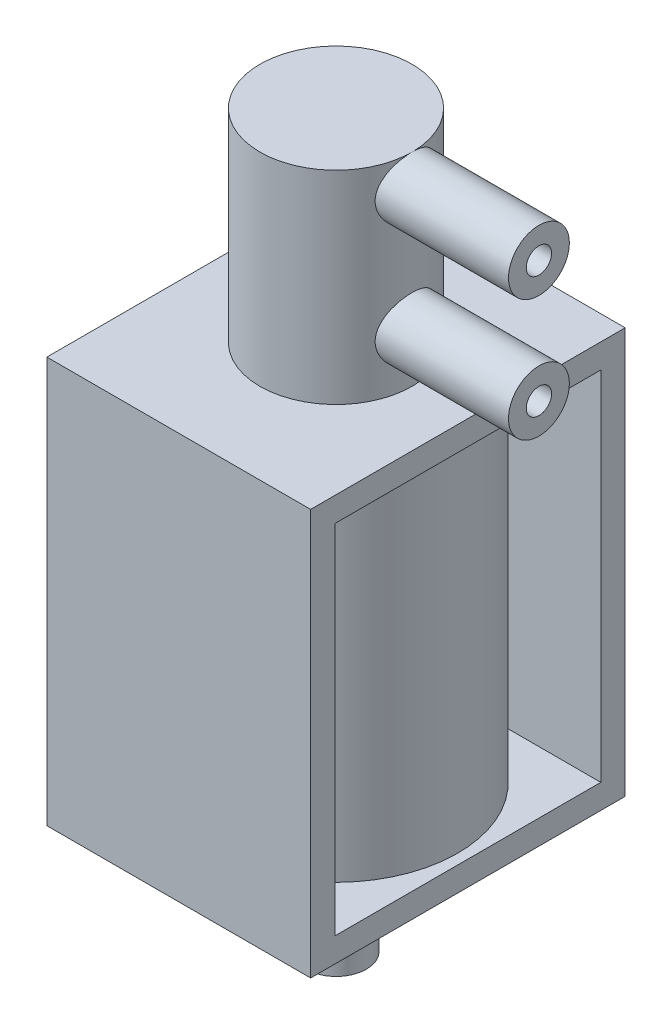
ISO-10303-21;
HEADER;
FILE_DESCRIPTION(('STEP AP214'),'2;1');
FILE_NAME('part.step','',(''),(''),'','','');
FILE_SCHEMA(('AUTOMOTIVE_DESIGN { 1 0 10303 214 1 1 1 1 }'));
ENDSEC;
DATA;
#1=APPLICATION_CONTEXT('core data for automotive mechanical design processes');
#2=APPLICATION_PROTOCOL_DEFINITION('international standard','automotive_design',2000,#1);
#3=PRODUCT_CONTEXT('',#1,'mechanical');
#4=PRODUCT('Part','Part','',(#3));
#5=PRODUCT_RELATED_PRODUCT_CATEGORY('part','',(#4));
#6=PRODUCT_DEFINITION_FORMATION('','',#4);
#7=PRODUCT_DEFINITION_CONTEXT('part definition',#1,'design');
#8=PRODUCT_DEFINITION('design','',#6,#7);
#9=PRODUCT_DEFINITION_SHAPE('','',#8);
#10=(LENGTH_UNIT() NAMED_UNIT(*) SI_UNIT(.MILLI.,.METRE.));
#11=(NAMED_UNIT(*) PLANE_ANGLE_UNIT() SI_UNIT($,.RADIAN.));
#12=(NAMED_UNIT(*) SI_UNIT($,.STERADIAN.) SOLID_ANGLE_UNIT());
#13=UNCERTAINTY_MEASURE_WITH_UNIT(LENGTH_MEASURE(1.E-05),#10,'distance_accuracy_value','');
#14=(GEOMETRIC_REPRESENTATION_CONTEXT(3) GLOBAL_UNCERTAINTY_ASSIGNED_CONTEXT((#13)) GLOBAL_UNIT_ASSIGNED_CONTEXT((#10,
#11,#12)) REPRESENTATION_CONTEXT('',''));
#15=CARTESIAN_POINT('',(0.,0.,0.));
#16=DIRECTION('',(0.,0.,1.));
#17=DIRECTION('',(1.,0.,0.));
#18=AXIS2_PLACEMENT_3D('',#15,#16,#17);
#19=CARTESIAN_POINT('',(10.,22.5,0.));
#20=DIRECTION('',(1.,0.,0.));
#21=DIRECTION('',(0.,0.,-1.));
#22=AXIS2_PLACEMENT_3D('',#19,#20,#21);
#23=PLANE('',#22);
#24=CARTESIAN_POINT('',(10.,22.5,0.));
#25=DIRECTION('',(1.,0.,0.));
#26=DIRECTION('',(0.,0.,-1.));
#27=AXIS2_PLACEMENT_3D('',#24,#25,#26);
#28=CIRCLE('',#27,1.5);
#29=CARTESIAN_POINT('',(10.,22.5,-1.5));
#30=VERTEX_POINT('',#29);
#31=EDGE_CURVE('E11',#30,#30,#28,.T.);
#32=ORIENTED_EDGE('',*,*,#31,.T.);
#33=EDGE_LOOP('',(#32));
#34=FACE_BOUND('',#33,.T.);
#35=CARTESIAN_POINT('',(10.,22.5,0.));
#36=DIRECTION('',(1.,0.,0.));
#37=DIRECTION('',(0.,0.,-1.));
#38=AXIS2_PLACEMENT_3D('',#35,#36,#37);
#39=CIRCLE('',#38,0.625);
#40=CARTESIAN_POINT('',(10.,22.5,-0.625));
#41=VERTEX_POINT('',#40);
#42=EDGE_CURVE('E52',#41,#41,#39,.T.);
#43=ORIENTED_EDGE('',*,*,#42,.F.);
#44=EDGE_LOOP('',(#43));
#45=FACE_BOUND('',#44,.T.);
#46=ADVANCED_FACE('F41',(#34,#45),#23,.T.);
#47=CARTESIAN_POINT('',(0.,22.5,0.));
#48=DIRECTION('',(1.,0.,0.));
#49=DIRECTION('',(0.,0.,-1.));
#50=AXIS2_PLACEMENT_3D('',#47,#48,#49);
#51=PLANE('',#50);
#52=CARTESIAN_POINT('',(0.,22.5,0.));
#53=DIRECTION('',(1.,0.,0.));
#54=DIRECTION('',(0.,0.,-1.));
#55=AXIS2_PLACEMENT_3D('',#52,#53,#54);
#56=CIRCLE('',#55,1.5);
#57=CARTESIAN_POINT('',(0.,22.5,-1.5));
#58=VERTEX_POINT('',#57);
#59=EDGE_CURVE('E45',#58,#58,#56,.T.);
#60=ORIENTED_EDGE('',*,*,#59,.F.);
#61=EDGE_LOOP('',(#60));
#62=FACE_BOUND('',#61,.T.);
#63=CARTESIAN_POINT('',(0.,22.5,0.));
#64=DIRECTION('',(1.,0.,0.));
#65=DIRECTION('',(0.,0.,-1.));
#66=AXIS2_PLACEMENT_3D('',#63,#64,#65);
#67=CIRCLE('',#66,0.625);
#68=CARTESIAN_POINT('',(0.,22.5,-0.625));
#69=VERTEX_POINT('',#68);
#70=EDGE_CURVE('E54',#69,#69,#67,.T.);
#71=ORIENTED_EDGE('',*,*,#70,.T.);
#72=EDGE_LOOP('',(#71));
#73=FACE_BOUND('',#72,.T.);
#74=ADVANCED_FACE('F64',(#62,#73),#51,.F.);
#75=CARTESIAN_POINT('',(10.,22.5,0.));
#76=DIRECTION('',(-1.,0.,0.));
#77=DIRECTION('',(0.,0.,1.));
#78=AXIS2_PLACEMENT_3D('',#75,#76,#77);
#79=CYLINDRICAL_SURFACE('',#78,1.5);
#80=ORIENTED_EDGE('',*,*,#31,.F.);
#81=EDGE_LOOP('',(#80));
#82=FACE_BOUND('',#81,.T.);
#83=ORIENTED_EDGE('',*,*,#59,.T.);
#84=EDGE_LOOP('',(#83));
#85=FACE_BOUND('',#84,.T.);
#86=ADVANCED_FACE('F43',(#82,#85),#79,.T.);
#87=CARTESIAN_POINT('',(10.,22.5,0.));
#88=DIRECTION('',(-1.,0.,0.));
#89=DIRECTION('',(0.,0.,1.));
#90=AXIS2_PLACEMENT_3D('',#87,#88,#89);
#91=CYLINDRICAL_SURFACE('',#90,0.625);
#92=ORIENTED_EDGE('',*,*,#42,.T.);
#93=EDGE_LOOP('',(#92));
#94=FACE_BOUND('',#93,.T.);
#95=ORIENTED_EDGE('',*,*,#70,.F.);
#96=EDGE_LOOP('',(#95));
#97=FACE_BOUND('',#96,.T.);
#98=ADVANCED_FACE('F60',(#94,#97),#91,.F.);
#99=CLOSED_SHELL('',(#46,#74,#86,#98));
#100=MANIFOLD_SOLID_BREP('B2',#99);
#101=CARTESIAN_POINT('',(10.,28.5,0.));
#102=DIRECTION('',(1.,0.,0.));
#103=DIRECTION('',(0.,0.,-1.));
#104=AXIS2_PLACEMENT_3D('',#101,#102,#103);
#105=PLANE('',#104);
#106=CARTESIAN_POINT('',(10.,28.5,0.));
#107=DIRECTION('',(1.,0.,0.));
#108=DIRECTION('',(0.,0.,-1.));
#109=AXIS2_PLACEMENT_3D('',#106,#107,#108);
#110=CIRCLE('',#109,1.5);
#111=CARTESIAN_POINT('',(10.,28.5,-1.5));
#112=VERTEX_POINT('',#111);
#113=EDGE_CURVE('E40',#112,#112,#110,.T.);
#114=ORIENTED_EDGE('',*,*,#113,.T.);
#115=EDGE_LOOP('',(#114));
#116=FACE_BOUND('',#115,.T.);
#117=CARTESIAN_POINT('',(10.,28.5,0.));
#118=DIRECTION('',(1.,0.,0.));
#119=DIRECTION('',(0.,0.,-1.));
#120=AXIS2_PLACEMENT_3D('',#117,#118,#119);
#121=CIRCLE('',#120,0.625);
#122=CARTESIAN_POINT('',(10.,28.5,-0.625));
#123=VERTEX_POINT('',#122);
#124=EDGE_CURVE('E122',#123,#123,#121,.T.);
#125=ORIENTED_EDGE('',*,*,#124,.F.);
#126=EDGE_LOOP('',(#125));
#127=FACE_BOUND('',#126,.T.);
#128=ADVANCED_FACE('F111',(#116,#127),#105,.T.);
#129=CARTESIAN_POINT('',(0.,28.5,0.));
#130=DIRECTION('',(1.,0.,0.));
#131=DIRECTION('',(0.,0.,-1.));
#132=AXIS2_PLACEMENT_3D('',#129,#130,#131);
#133=PLANE('',#132);
#134=CARTESIAN_POINT('',(0.,28.5,0.));
#135=DIRECTION('',(1.,0.,0.));
#136=DIRECTION('',(0.,0.,-1.));
#137=AXIS2_PLACEMENT_3D('',#134,#135,#136);
#138=CIRCLE('',#137,1.5);
#139=CARTESIAN_POINT('',(0.,28.5,-1.5));
#140=VERTEX_POINT('',#139);
#141=EDGE_CURVE('E115',#140,#140,#138,.T.);
#142=ORIENTED_EDGE('',*,*,#141,.F.);
#143=EDGE_LOOP('',(#142));
#144=FACE_BOUND('',#143,.T.);
#145=CARTESIAN_POINT('',(0.,28.5,0.));
#146=DIRECTION('',(1.,0.,0.));
#147=DIRECTION('',(0.,0.,-1.));
#148=AXIS2_PLACEMENT_3D('',#145,#146,#147);
#149=CIRCLE('',#148,0.625);
#150=CARTESIAN_POINT('',(0.,28.5,-0.625));
#151=VERTEX_POINT('',#150);
#152=EDGE_CURVE('E124',#151,#151,#149,.T.);
#153=ORIENTED_EDGE('',*,*,#152,.T.);
#154=EDGE_LOOP('',(#153));
#155=FACE_BOUND('',#154,.T.);
#156=ADVANCED_FACE('F134',(#144,#155),#133,.F.);
#157=CARTESIAN_POINT('',(10.,28.5,0.));
#158=DIRECTION('',(-1.,0.,0.));
#159=DIRECTION('',(0.,0.,1.));
#160=AXIS2_PLACEMENT_3D('',#157,#158,#159);
#161=CYLINDRICAL_SURFACE('',#160,1.5);
#162=ORIENTED_EDGE('',*,*,#113,.F.);
#163=EDGE_LOOP('',(#162));
#164=FACE_BOUND('',#163,.T.);
#165=ORIENTED_EDGE('',*,*,#141,.T.);
#166=EDGE_LOOP('',(#165));
#167=FACE_BOUND('',#166,.T.);
#168=ADVANCED_FACE('F113',(#164,#167),#161,.T.);
#169=CARTESIAN_POINT('',(10.,28.5,0.));
#170=DIRECTION('',(-1.,0.,0.));
#171=DIRECTION('',(0.,0.,1.));
#172=AXIS2_PLACEMENT_3D('',#169,#170,#171);
#173=CYLINDRICAL_SURFACE('',#172,0.625);
#174=ORIENTED_EDGE('',*,*,#124,.T.);
#175=EDGE_LOOP('',(#174));
#176=FACE_BOUND('',#175,.T.);
#177=ORIENTED_EDGE('',*,*,#152,.F.);
#178=EDGE_LOOP('',(#177));
#179=FACE_BOUND('',#178,.T.);
#180=ADVANCED_FACE('F130',(#176,#179),#173,.F.);
#181=CLOSED_SHELL('',(#128,#156,#168,#180));
#182=MANIFOLD_SOLID_BREP('B6',#181);
#183=CARTESIAN_POINT('',(6.5,20.,-7.75));
#184=DIRECTION('',(-1.,0.,0.));
#185=DIRECTION('',(0.,0.,1.));
#186=AXIS2_PLACEMENT_3D('',#183,#184,#185);
#187=PLANE('',#186);
#188=DIRECTION('',(0.,0.,-1.));
#189=VECTOR('',#188,1.);
#190=CARTESIAN_POINT('',(6.5,1.2,6.55));
#191=LINE('',#190,#189);
#192=CARTESIAN_POINT('',(6.5,1.2,6.55));
#193=VERTEX_POINT('',#192);
#194=CARTESIAN_POINT('',(6.5,1.2,-6.55));
#195=VERTEX_POINT('',#194);
#196=EDGE_CURVE('E263',#193,#195,#191,.T.);
#197=ORIENTED_EDGE('',*,*,#196,.F.);
#198=DIRECTION('',(0.,-1.,0.));
#199=VECTOR('',#198,1.);
#200=CARTESIAN_POINT('',(6.5,18.8,6.55));
#201=LINE('',#200,#199);
#202=CARTESIAN_POINT('',(6.5,18.8,6.55));
#203=VERTEX_POINT('',#202);
#204=EDGE_CURVE('E186',#203,#193,#201,.T.);
#205=ORIENTED_EDGE('',*,*,#204,.F.);
#206=DIRECTION('',(0.,0.,1.));
#207=VECTOR('',#206,1.);
#208=CARTESIAN_POINT('',(6.5,18.8,6.55));
#209=LINE('',#208,#207);
#210=CARTESIAN_POINT('',(6.5,18.8,-6.55));
#211=VERTEX_POINT('',#210);
#212=EDGE_CURVE('E254',#211,#203,#209,.T.);
#213=ORIENTED_EDGE('',*,*,#212,.F.);
#214=DIRECTION('',(0.,1.,0.));
#215=VECTOR('',#214,1.);
#216=CARTESIAN_POINT('',(6.5,18.8,-6.55));
#217=LINE('',#216,#215);
#218=EDGE_CURVE('E257',#195,#211,#217,.T.);
#219=ORIENTED_EDGE('',*,*,#218,.F.);
#220=EDGE_LOOP('',(#197,#205,#213,#219));
#221=FACE_BOUND('',#220,.T.);
#222=DIRECTION('',(0.,0.,-1.));
#223=VECTOR('',#222,1.);
#224=CARTESIAN_POINT('',(6.5,0.,-7.75));
#225=LINE('',#224,#223);
#226=CARTESIAN_POINT('',(6.5,0.,7.75));
#227=VERTEX_POINT('',#226);
#228=CARTESIAN_POINT('',(6.5,0.,-7.75));
#229=VERTEX_POINT('',#228);
#230=EDGE_CURVE('E288',#227,#229,#225,.T.);
#231=ORIENTED_EDGE('',*,*,#230,.T.);
#232=DIRECTION('',(0.,-1.,0.));
#233=VECTOR('',#232,1.);
#234=CARTESIAN_POINT('',(6.5,20.,-7.75));
#235=LINE('',#234,#233);
#236=CARTESIAN_POINT('',(6.5,20.,-7.75));
#237=VERTEX_POINT('',#236);
#238=EDGE_CURVE('E291',#237,#229,#235,.T.);
#239=ORIENTED_EDGE('',*,*,#238,.F.);
#240=DIRECTION('',(0.,0.,-1.));
#241=VECTOR('',#240,1.);
#242=CARTESIAN_POINT('',(6.5,20.,-7.75));
#243=LINE('',#242,#241);
#244=CARTESIAN_POINT('',(6.5,20.,7.75));
#245=VERTEX_POINT('',#244);
#246=EDGE_CURVE('E292',#245,#237,#243,.T.);
#247=ORIENTED_EDGE('',*,*,#246,.F.);
#248=DIRECTION('',(0.,-1.,0.));
#249=VECTOR('',#248,1.);
#250=CARTESIAN_POINT('',(6.5,20.,7.75));
#251=LINE('',#250,#249);
#252=EDGE_CURVE('E302',#245,#227,#251,.T.);
#253=ORIENTED_EDGE('',*,*,#252,.T.);
#254=EDGE_LOOP('',(#231,#239,#247,#253));
#255=FACE_BOUND('',#254,.T.);
#256=ADVANCED_FACE('F172',(#221,#255),#187,.F.);
#257=CARTESIAN_POINT('',(-6.5,20.,-7.75));
#258=DIRECTION('',(0.,0.,1.));
#259=DIRECTION('',(1.,0.,0.));
#260=AXIS2_PLACEMENT_3D('',#257,#258,#259);
#261=PLANE('',#260);
#262=DIRECTION('',(-1.,0.,0.));
#263=VECTOR('',#262,1.);
#264=CARTESIAN_POINT('',(-6.5,0.,-7.75));
#265=LINE('',#264,#263);
#266=CARTESIAN_POINT('',(-6.5,0.,-7.75));
#267=VERTEX_POINT('',#266);
#268=EDGE_CURVE('E305',#229,#267,#265,.T.);
#269=ORIENTED_EDGE('',*,*,#268,.T.);
#270=DIRECTION('',(0.,-1.,0.));
#271=VECTOR('',#270,1.);
#272=CARTESIAN_POINT('',(-6.5,20.,-7.75));
#273=LINE('',#272,#271);
#274=CARTESIAN_POINT('',(-6.5,20.,-7.75));
#275=VERTEX_POINT('',#274);
#276=EDGE_CURVE('E315',#275,#267,#273,.T.);
#277=ORIENTED_EDGE('',*,*,#276,.F.);
#278=DIRECTION('',(-1.,0.,0.));
#279=VECTOR('',#278,1.);
#280=CARTESIAN_POINT('',(-6.5,20.,-7.75));
#281=LINE('',#280,#279);
#282=EDGE_CURVE('E295',#237,#275,#281,.T.);
#283=ORIENTED_EDGE('',*,*,#282,.F.);
#284=ORIENTED_EDGE('',*,*,#238,.T.);
#285=EDGE_LOOP('',(#269,#277,#283,#284));
#286=FACE_BOUND('',#285,.T.);
#287=ADVANCED_FACE('F337',(#286),#261,.F.);
#288=CARTESIAN_POINT('',(-6.5,20.,-7.75));
#289=DIRECTION('',(1.,0.,0.));
#290=DIRECTION('',(0.,0.,-1.));
#291=AXIS2_PLACEMENT_3D('',#288,#289,#290);
#292=PLANE('',#291);
#293=DIRECTION('',(0.,0.,1.));
#294=VECTOR('',#293,1.);
#295=CARTESIAN_POINT('',(-6.5,18.8,6.55));
#296=LINE('',#295,#294);
#297=CARTESIAN_POINT('',(-6.50000000000001,18.8,-6.55));
#298=VERTEX_POINT('',#297);
#299=CARTESIAN_POINT('',(-6.5,18.8,6.55));
#300=VERTEX_POINT('',#299);
#301=EDGE_CURVE('E244',#298,#300,#296,.T.);
#302=ORIENTED_EDGE('',*,*,#301,.T.);
#303=DIRECTION('',(0.,-1.,0.));
#304=VECTOR('',#303,1.);
#305=CARTESIAN_POINT('',(-6.5,18.8,6.55));
#306=LINE('',#305,#304);
#307=CARTESIAN_POINT('',(-6.5,1.2,6.55));
#308=VERTEX_POINT('',#307);
#309=EDGE_CURVE('E238',#300,#308,#306,.T.);
#310=ORIENTED_EDGE('',*,*,#309,.T.);
#311=DIRECTION('',(0.,0.,-1.));
#312=VECTOR('',#311,1.);
#313=CARTESIAN_POINT('',(-6.5,1.2,6.55));
#314=LINE('',#313,#312);
#315=CARTESIAN_POINT('',(-6.5,1.2,-6.55));
#316=VERTEX_POINT('',#315);
#317=EDGE_CURVE('E247',#308,#316,#314,.T.);
#318=ORIENTED_EDGE('',*,*,#317,.T.);
#319=DIRECTION('',(0.,1.,0.));
#320=VECTOR('',#319,1.);
#321=CARTESIAN_POINT('',(-6.50000000000001,18.8,-6.55));
#322=LINE('',#321,#320);
#323=EDGE_CURVE('E194',#316,#298,#322,.T.);
#324=ORIENTED_EDGE('',*,*,#323,.T.);
#325=EDGE_LOOP('',(#302,#310,#318,#324));
#326=FACE_BOUND('',#325,.T.);
#327=DIRECTION('',(0.,0.,1.));
#328=VECTOR('',#327,1.);
#329=CARTESIAN_POINT('',(-6.5,0.,-7.75));
#330=LINE('',#329,#328);
#331=CARTESIAN_POINT('',(-6.5,0.,7.75));
#332=VERTEX_POINT('',#331);
#333=EDGE_CURVE('E307',#267,#332,#330,.T.);
#334=ORIENTED_EDGE('',*,*,#333,.T.);
#335=DIRECTION('',(0.,-1.,0.));
#336=VECTOR('',#335,1.);
#337=CARTESIAN_POINT('',(-6.5,20.,7.75));
#338=LINE('',#337,#336);
#339=CARTESIAN_POINT('',(-6.5,20.,7.75));
#340=VERTEX_POINT('',#339);
#341=EDGE_CURVE('E312',#340,#332,#338,.T.);
#342=ORIENTED_EDGE('',*,*,#341,.F.);
#343=DIRECTION('',(0.,0.,1.));
#344=VECTOR('',#343,1.);
#345=CARTESIAN_POINT('',(-6.5,20.,-7.75));
#346=LINE('',#345,#344);
#347=EDGE_CURVE('E298',#275,#340,#346,.T.);
#348=ORIENTED_EDGE('',*,*,#347,.F.);
#349=ORIENTED_EDGE('',*,*,#276,.T.);
#350=EDGE_LOOP('',(#334,#342,#348,#349));
#351=FACE_BOUND('',#350,.T.);
#352=ADVANCED_FACE('F251',(#326,#351),#292,.F.);
#353=CARTESIAN_POINT('',(-6.5,20.,7.75));
#354=DIRECTION('',(0.,0.,-1.));
#355=DIRECTION('',(-1.,0.,0.));
#356=AXIS2_PLACEMENT_3D('',#353,#354,#355);
#357=PLANE('',#356);
#358=DIRECTION('',(1.,0.,0.));
#359=VECTOR('',#358,1.);
#360=CARTESIAN_POINT('',(-6.5,0.,7.75));
#361=LINE('',#360,#359);
#362=EDGE_CURVE('E296',#332,#227,#361,.T.);
#363=ORIENTED_EDGE('',*,*,#362,.T.);
#364=ORIENTED_EDGE('',*,*,#252,.F.);
#365=DIRECTION('',(1.,0.,0.));
#366=VECTOR('',#365,1.);
#367=CARTESIAN_POINT('',(-6.5,20.,7.75));
#368=LINE('',#367,#366);
#369=EDGE_CURVE('E300',#340,#245,#368,.T.);
#370=ORIENTED_EDGE('',*,*,#369,.F.);
#371=ORIENTED_EDGE('',*,*,#341,.T.);
#372=EDGE_LOOP('',(#363,#364,#370,#371));
#373=FACE_BOUND('',#372,.T.);
#374=ADVANCED_FACE('F360',(#373),#357,.F.);
#375=CARTESIAN_POINT('',(0.,20.,0.));
#376=DIRECTION('',(0.,1.,0.));
#377=DIRECTION('',(0.,0.,1.));
#378=AXIS2_PLACEMENT_3D('',#375,#376,#377);
#379=PLANE('',#378);
#380=CARTESIAN_POINT('',(0.,20.,0.));
#381=DIRECTION('',(0.,1.,0.));
#382=DIRECTION('',(0.,0.,1.));
#383=AXIS2_PLACEMENT_3D('',#380,#381,#382);
#384=CIRCLE('',#383,3.75);
#385=CARTESIAN_POINT('',(0.,20.,3.75));
#386=VERTEX_POINT('',#385);
#387=EDGE_CURVE('E276',#386,#386,#384,.T.);
#388=ORIENTED_EDGE('',*,*,#387,.F.);
#389=EDGE_LOOP('',(#388));
#390=FACE_BOUND('',#389,.T.);
#391=ORIENTED_EDGE('',*,*,#246,.T.);
#392=ORIENTED_EDGE('',*,*,#282,.T.);
#393=ORIENTED_EDGE('',*,*,#347,.T.);
#394=ORIENTED_EDGE('',*,*,#369,.T.);
#395=EDGE_LOOP('',(#391,#392,#393,#394));
#396=FACE_BOUND('',#395,.T.);
#397=ADVANCED_FACE('F356',(#390,#396),#379,.T.);
#398=CARTESIAN_POINT('',(0.,0.,0.));
#399=DIRECTION('',(0.,1.,0.));
#400=DIRECTION('',(0.,0.,1.));
#401=AXIS2_PLACEMENT_3D('',#398,#399,#400);
#402=PLANE('',#401);
#403=CARTESIAN_POINT('',(0.,0.,0.));
#404=DIRECTION('',(0.,-1.,0.));
#405=DIRECTION('',(0.,0.,-1.));
#406=AXIS2_PLACEMENT_3D('',#403,#404,#405);
#407=CIRCLE('',#406,1.5);
#408=CARTESIAN_POINT('',(0.,0.,-1.5));
#409=VERTEX_POINT('',#408);
#410=EDGE_CURVE('E279',#409,#409,#407,.T.);
#411=ORIENTED_EDGE('',*,*,#410,.F.);
#412=EDGE_LOOP('',(#411));
#413=FACE_BOUND('',#412,.T.);
#414=ORIENTED_EDGE('',*,*,#230,.F.);
#415=ORIENTED_EDGE('',*,*,#362,.F.);
#416=ORIENTED_EDGE('',*,*,#333,.F.);
#417=ORIENTED_EDGE('',*,*,#268,.F.);
#418=EDGE_LOOP('',(#414,#415,#416,#417));
#419=FACE_BOUND('',#418,.T.);
#420=ADVANCED_FACE('F351',(#413,#419),#402,.F.);
#421=CARTESIAN_POINT('',(0.,-6.,0.));
#422=DIRECTION('',(0.,-1.,0.));
#423=DIRECTION('',(0.,0.,-1.));
#424=AXIS2_PLACEMENT_3D('',#421,#422,#423);
#425=PLANE('',#424);
#426=CARTESIAN_POINT('',(0.,-6.,0.));
#427=DIRECTION('',(0.,-1.,0.));
#428=DIRECTION('',(0.,0.,-1.));
#429=AXIS2_PLACEMENT_3D('',#426,#427,#428);
#430=CIRCLE('',#429,1.5);
#431=CARTESIAN_POINT('',(0.,-6.,-1.5));
#432=VERTEX_POINT('',#431);
#433=EDGE_CURVE('E283',#432,#432,#430,.T.);
#434=ORIENTED_EDGE('',*,*,#433,.T.);
#435=EDGE_LOOP('',(#434));
#436=FACE_BOUND('',#435,.T.);
#437=CARTESIAN_POINT('',(0.,-6.,0.));
#438=DIRECTION('',(0.,-1.,0.));
#439=DIRECTION('',(0.,0.,-1.));
#440=AXIS2_PLACEMENT_3D('',#437,#438,#439);
#441=CIRCLE('',#440,0.625);
#442=CARTESIAN_POINT('',(0.,-6.,-0.625));
#443=VERTEX_POINT('',#442);
#444=EDGE_CURVE('E280',#443,#443,#441,.T.);
#445=ORIENTED_EDGE('',*,*,#444,.F.);
#446=EDGE_LOOP('',(#445));
#447=FACE_BOUND('',#446,.T.);
#448=ADVANCED_FACE('F370',(#436,#447),#425,.T.);
#449=CARTESIAN_POINT('',(0.,-6.,0.));
#450=DIRECTION('',(0.,1.,0.));
#451=DIRECTION('',(0.,0.,1.));
#452=AXIS2_PLACEMENT_3D('',#449,#450,#451);
#453=CYLINDRICAL_SURFACE('',#452,1.5);
#454=ORIENTED_EDGE('',*,*,#433,.F.);
#455=EDGE_LOOP('',(#454));
#456=FACE_BOUND('',#455,.T.);
#457=ORIENTED_EDGE('',*,*,#410,.T.);
#458=EDGE_LOOP('',(#457));
#459=FACE_BOUND('',#458,.T.);
#460=ADVANCED_FACE('F376',(#456,#459),#453,.T.);
#461=CARTESIAN_POINT('',(0.,-6.,0.));
#462=DIRECTION('',(0.,1.,0.));
#463=DIRECTION('',(0.,0.,1.));
#464=AXIS2_PLACEMENT_3D('',#461,#462,#463);
#465=CYLINDRICAL_SURFACE('',#464,0.625);
#466=ORIENTED_EDGE('',*,*,#444,.T.);
#467=EDGE_LOOP('',(#466));
#468=FACE_BOUND('',#467,.T.);
#469=CARTESIAN_POINT('',(0.,0.,0.));
#470=DIRECTION('',(0.,-1.,0.));
#471=DIRECTION('',(0.,0.,-1.));
#472=AXIS2_PLACEMENT_3D('',#469,#470,#471);
#473=CIRCLE('',#472,0.625);
#474=CARTESIAN_POINT('',(0.,0.,-0.625));
#475=VERTEX_POINT('',#474);
#476=EDGE_CURVE('E275',#475,#475,#473,.T.);
#477=ORIENTED_EDGE('',*,*,#476,.F.);
#478=EDGE_LOOP('',(#477));
#479=FACE_BOUND('',#478,.T.);
#480=ADVANCED_FACE('F379',(#468,#479),#465,.F.);
#481=ORIENTED_EDGE('',*,*,#476,.T.);
#482=EDGE_LOOP('',(#481));
#483=FACE_BOUND('',#482,.T.);
#484=ADVANCED_FACE('F372',(#483),#402,.F.);
#485=CARTESIAN_POINT('',(0.,30.,0.));
#486=DIRECTION('',(0.,-1.,0.));
#487=DIRECTION('',(0.,0.,-1.));
#488=AXIS2_PLACEMENT_3D('',#485,#486,#487);
#489=CYLINDRICAL_SURFACE('',#488,3.75);
#490=CARTESIAN_POINT('',(0.,30.,0.));
#491=DIRECTION('',(0.,1.,0.));
#492=DIRECTION('',(0.,0.,1.));
#493=AXIS2_PLACEMENT_3D('',#490,#491,#492);
#494=CIRCLE('',#493,3.75);
#495=CARTESIAN_POINT('',(0.,30.,3.75));
#496=VERTEX_POINT('',#495);
#497=EDGE_CURVE('E269',#496,#496,#494,.T.);
#498=ORIENTED_EDGE('',*,*,#497,.F.);
#499=EDGE_LOOP('',(#498));
#500=FACE_BOUND('',#499,.T.);
#501=ORIENTED_EDGE('',*,*,#387,.T.);
#502=EDGE_LOOP('',(#501));
#503=FACE_BOUND('',#502,.T.);
#504=ADVANCED_FACE('F387',(#500,#503),#489,.T.);
#505=CARTESIAN_POINT('',(0.,30.,0.));
#506=DIRECTION('',(0.,1.,0.));
#507=DIRECTION('',(0.,0.,1.));
#508=AXIS2_PLACEMENT_3D('',#505,#506,#507);
#509=PLANE('',#508);
#510=ORIENTED_EDGE('',*,*,#497,.T.);
#511=EDGE_LOOP('',(#510));
#512=FACE_BOUND('',#511,.T.);
#513=ADVANCED_FACE('F390',(#512),#509,.T.);
#514=CARTESIAN_POINT('',(-6.5,18.8,6.55));
#515=DIRECTION('',(0.,0.,1.));
#516=DIRECTION('',(1.,0.,0.));
#517=AXIS2_PLACEMENT_3D('',#514,#515,#516);
#518=PLANE('',#517);
#519=ORIENTED_EDGE('',*,*,#204,.T.);
#520=DIRECTION('',(1.,0.,0.));
#521=VECTOR('',#520,1.);
#522=CARTESIAN_POINT('',(-6.5,1.2,6.55));
#523=LINE('',#522,#521);
#524=EDGE_CURVE('E234',#308,#193,#523,.T.);
#525=ORIENTED_EDGE('',*,*,#524,.F.);
#526=ORIENTED_EDGE('',*,*,#309,.F.);
#527=DIRECTION('',(1.,0.,0.));
#528=VECTOR('',#527,1.);
#529=CARTESIAN_POINT('',(-6.5,18.8,6.55));
#530=LINE('',#529,#528);
#531=EDGE_CURVE('E267',#300,#203,#530,.T.);
#532=ORIENTED_EDGE('',*,*,#531,.T.);
#533=EDGE_LOOP('',(#519,#525,#526,#532));
#534=FACE_BOUND('',#533,.T.);
#535=ADVANCED_FACE('F236',(#534),#518,.F.);
#536=CARTESIAN_POINT('',(-6.5,18.8,6.55));
#537=DIRECTION('',(0.,1.,0.));
#538=DIRECTION('',(0.,0.,1.));
#539=AXIS2_PLACEMENT_3D('',#536,#537,#538);
#540=PLANE('',#539);
#541=CARTESIAN_POINT('',(0.,18.8,0.));
#542=DIRECTION('',(0.,1.,0.));
#543=DIRECTION('',(0.,0.,1.));
#544=AXIS2_PLACEMENT_3D('',#541,#542,#543);
#545=CIRCLE('',#544,6.);
#546=CARTESIAN_POINT('',(0.,18.8,-6.));
#547=VERTEX_POINT('',#546);
#548=EDGE_CURVE('E109',#547,#547,#545,.F.);
#549=ORIENTED_EDGE('',*,*,#548,.F.);
#550=EDGE_LOOP('',(#549));
#551=FACE_BOUND('',#550,.T.);
#552=ORIENTED_EDGE('',*,*,#212,.T.);
#553=ORIENTED_EDGE('',*,*,#531,.F.);
#554=ORIENTED_EDGE('',*,*,#301,.F.);
#555=DIRECTION('',(1.,0.,0.));
#556=VECTOR('',#555,1.);
#557=CARTESIAN_POINT('',(-6.50000000000001,18.8,-6.55));
#558=LINE('',#557,#556);
#559=EDGE_CURVE('E270',#298,#211,#558,.T.);
#560=ORIENTED_EDGE('',*,*,#559,.T.);
#561=EDGE_LOOP('',(#552,#553,#554,#560));
#562=FACE_BOUND('',#561,.T.);
#563=ADVANCED_FACE('F333',(#551,#562),#540,.F.);
#564=CARTESIAN_POINT('',(-6.50000000000001,18.8,-6.55));
#565=DIRECTION('',(0.,0.,-1.));
#566=DIRECTION('',(-1.,0.,0.));
#567=AXIS2_PLACEMENT_3D('',#564,#565,#566);
#568=PLANE('',#567);
#569=ORIENTED_EDGE('',*,*,#218,.T.);
#570=ORIENTED_EDGE('',*,*,#559,.F.);
#571=ORIENTED_EDGE('',*,*,#323,.F.);
#572=DIRECTION('',(1.,0.,0.));
#573=VECTOR('',#572,1.);
#574=CARTESIAN_POINT('',(-6.50000000000001,1.2,-6.55));
#575=LINE('',#574,#573);
#576=EDGE_CURVE('E243',#316,#195,#575,.T.);
#577=ORIENTED_EDGE('',*,*,#576,.T.);
#578=EDGE_LOOP('',(#569,#570,#571,#577));
#579=FACE_BOUND('',#578,.T.);
#580=ADVANCED_FACE('F326',(#579),#568,.F.);
#581=CARTESIAN_POINT('',(-6.5,1.2,6.55));
#582=DIRECTION('',(0.,-1.,0.));
#583=DIRECTION('',(0.,0.,-1.));
#584=AXIS2_PLACEMENT_3D('',#581,#582,#583);
#585=PLANE('',#584);
#586=CARTESIAN_POINT('',(0.,1.2,0.));
#587=DIRECTION('',(0.,-1.,0.));
#588=DIRECTION('',(0.,0.,-1.));
#589=AXIS2_PLACEMENT_3D('',#586,#587,#588);
#590=CIRCLE('',#589,6.);
#591=CARTESIAN_POINT('',(0.,1.2,-6.));
#592=VERTEX_POINT('',#591);
#593=EDGE_CURVE('E179',#592,#592,#590,.F.);
#594=ORIENTED_EDGE('',*,*,#593,.F.);
#595=EDGE_LOOP('',(#594));
#596=FACE_BOUND('',#595,.T.);
#597=ORIENTED_EDGE('',*,*,#196,.T.);
#598=ORIENTED_EDGE('',*,*,#576,.F.);
#599=ORIENTED_EDGE('',*,*,#317,.F.);
#600=ORIENTED_EDGE('',*,*,#524,.T.);
#601=EDGE_LOOP('',(#597,#598,#599,#600));
#602=FACE_BOUND('',#601,.T.);
#603=ADVANCED_FACE('F248',(#596,#602),#585,.F.);
#604=CARTESIAN_POINT('',(0.,30.002,0.));
#605=DIRECTION('',(0.,-1.,0.));
#606=DIRECTION('',(0.,0.,-1.));
#607=AXIS2_PLACEMENT_3D('',#604,#605,#606);
#608=CYLINDRICAL_SURFACE('',#607,6.);
#609=CARTESIAN_POINT('',(0.,1.2,-6.));
#610=CARTESIAN_POINT('',(0.,1.38333333333333,-6.));
#611=CARTESIAN_POINT('',(0.,1.56666666666667,-6.));
#612=CARTESIAN_POINT('',(0.,1.93333333333333,-6.));
#613=CARTESIAN_POINT('',(0.,2.11666666666667,-6.));
#614=CARTESIAN_POINT('',(0.,2.48333333333333,-6.));
#615=CARTESIAN_POINT('',(0.,2.66666666666667,-6.));
#616=CARTESIAN_POINT('',(0.,3.03333333333333,-6.));
#617=CARTESIAN_POINT('',(0.,3.21666666666667,-6.));
#618=CARTESIAN_POINT('',(0.,3.58333333333333,-6.));
#619=CARTESIAN_POINT('',(0.,3.76666666666667,-6.));
#620=CARTESIAN_POINT('',(0.,4.13333333333333,-6.));
#621=CARTESIAN_POINT('',(0.,4.31666666666667,-6.));
#622=CARTESIAN_POINT('',(0.,4.68333333333333,-6.));
#623=CARTESIAN_POINT('',(0.,4.86666666666667,-6.));
#624=CARTESIAN_POINT('',(0.,5.23333333333333,-6.));
#625=CARTESIAN_POINT('',(0.,5.41666666666667,-6.));
#626=CARTESIAN_POINT('',(0.,5.78333333333333,-6.));
#627=CARTESIAN_POINT('',(0.,5.96666666666667,-6.));
#628=CARTESIAN_POINT('',(0.,6.33333333333333,-6.));
#629=CARTESIAN_POINT('',(0.,6.51666666666667,-6.));
#630=CARTESIAN_POINT('',(0.,6.88333333333333,-6.));
#631=CARTESIAN_POINT('',(0.,7.06666666666667,-6.));
#632=CARTESIAN_POINT('',(0.,7.43333333333333,-6.));
#633=CARTESIAN_POINT('',(0.,7.61666666666667,-6.));
#634=CARTESIAN_POINT('',(0.,7.98333333333333,-6.));
#635=CARTESIAN_POINT('',(0.,8.16666666666667,-6.));
#636=CARTESIAN_POINT('',(0.,8.53333333333333,-6.));
#637=CARTESIAN_POINT('',(0.,8.71666666666667,-6.));
#638=CARTESIAN_POINT('',(0.,9.08333333333333,-6.));
#639=CARTESIAN_POINT('',(0.,9.26666666666667,-6.));
#640=CARTESIAN_POINT('',(0.,9.63333333333333,-6.));
#641=CARTESIAN_POINT('',(0.,9.81666666666667,-6.));
#642=CARTESIAN_POINT('',(0.,10.1833333333333,-6.));
#643=CARTESIAN_POINT('',(0.,10.3666666666667,-6.));
#644=CARTESIAN_POINT('',(0.,10.7333333333333,-6.));
#645=CARTESIAN_POINT('',(0.,10.9166666666667,-6.));
#646=CARTESIAN_POINT('',(0.,11.2833333333333,-6.));
#647=CARTESIAN_POINT('',(0.,11.4666666666667,-6.));
#648=CARTESIAN_POINT('',(0.,11.8333333333333,-6.));
#649=CARTESIAN_POINT('',(0.,12.0166666666667,-6.));
#650=CARTESIAN_POINT('',(0.,12.3833333333333,-6.));
#651=CARTESIAN_POINT('',(0.,12.5666666666667,-6.));
#652=CARTESIAN_POINT('',(0.,12.9333333333333,-6.));
#653=CARTESIAN_POINT('',(0.,13.1166666666667,-6.));
#654=CARTESIAN_POINT('',(0.,13.4833333333333,-6.));
#655=CARTESIAN_POINT('',(0.,13.6666666666667,-6.));
#656=CARTESIAN_POINT('',(0.,14.0333333333333,-6.));
#657=CARTESIAN_POINT('',(0.,14.2166666666667,-6.));
#658=CARTESIAN_POINT('',(0.,14.5833333333333,-6.));
#659=CARTESIAN_POINT('',(0.,14.7666666666667,-6.));
#660=CARTESIAN_POINT('',(0.,15.1333333333333,-6.));
#661=CARTESIAN_POINT('',(0.,15.3166666666667,-6.));
#662=CARTESIAN_POINT('',(0.,15.6833333333333,-6.));
#663=CARTESIAN_POINT('',(0.,15.8666666666667,-6.));
#664=CARTESIAN_POINT('',(0.,16.2333333333333,-6.));
#665=CARTESIAN_POINT('',(0.,16.4166666666667,-6.));
#666=CARTESIAN_POINT('',(0.,16.7833333333333,-6.));
#667=CARTESIAN_POINT('',(0.,16.9666666666667,-6.));
#668=CARTESIAN_POINT('',(0.,17.3333333333333,-6.));
#669=CARTESIAN_POINT('',(0.,17.5166666666667,-6.));
#670=CARTESIAN_POINT('',(0.,17.8833333333333,-6.));
#671=CARTESIAN_POINT('',(0.,18.0666666666667,-6.));
#672=CARTESIAN_POINT('',(0.,18.4333333333333,-6.));
#673=CARTESIAN_POINT('',(0.,18.6166666666667,-6.));
#674=CARTESIAN_POINT('',(0.,18.8,-6.));
#675=B_SPLINE_CURVE_WITH_KNOTS('',3,(#609,#610,#611,#612,#613,#614,#615,#616,#617,#618,#619,
#620,#621,#622,#623,#624,#625,#626,#627,#628,#629,#630,#631,#632,#633,#634,#635,#636,#637,#638,
#639,#640,#641,#642,#643,#644,#645,#646,#647,#648,#649,#650,#651,#652,#653,#654,#655,#656,#657,
#658,#659,#660,#661,#662,#663,#664,#665,#666,#667,#668,#669,#670,#671,#672,#673,#674),
.UNSPECIFIED.,.F.,.F.,(4,2,2,2,2,2,2,2,2,2,2,2,2,2,2,2,2,2,2,2,2,2,2,2,2,2,2,2,2,2,2,2,4),(0.,
0.549999999999998,1.1,1.65,2.2,2.75,3.3,3.85,4.4,4.95,5.5,6.05,6.6,7.15,7.7,8.25,8.8,9.35,9.9,
10.45,11.,11.55,12.1,12.65,13.2,13.75,14.3,14.85,15.4,15.95,16.5,17.05,17.6),.UNSPECIFIED.);
#676=EDGE_CURVE('BSEAM322',#592,#547,#675,.T.);
#677=ORIENTED_EDGE('',*,*,#593,.T.);
#678=ORIENTED_EDGE('',*,*,#548,.T.);
#679=ORIENTED_EDGE('',*,*,#676,.T.);
#680=ORIENTED_EDGE('',*,*,#676,.F.);
#681=EDGE_LOOP('',(#677,#679,#678,#680));
#682=FACE_BOUND('',#681,.T.);
#683=ADVANCED_FACE('F322',(#682),#608,.T.);
#684=CLOSED_SHELL('',(#256,#287,#352,#374,#397,#420,#448,#460,#480,#484,#504,#513,#535,#563,
#580,#603,#683));
#685=MANIFOLD_SOLID_BREP('B35',#684);
#686=ADVANCED_BREP_SHAPE_REPRESENTATION('',(#18,#100,#182,#685),#14);
#687=SHAPE_DEFINITION_REPRESENTATION(#9,#686);
ENDSEC;
END-ISO-10303-21;
